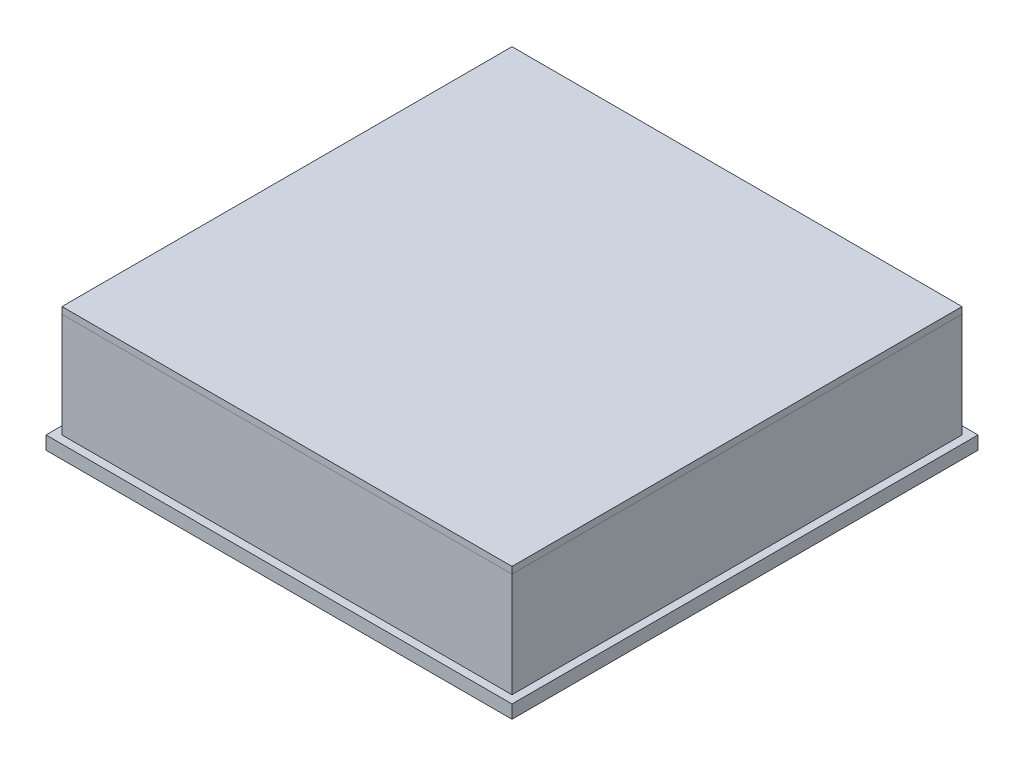
ISO-10303-21;
HEADER;
FILE_DESCRIPTION(('STEP AP214'),'2;1');
FILE_NAME('part.step','',(''),(''),'','','');
FILE_SCHEMA(('AUTOMOTIVE_DESIGN { 1 0 10303 214 1 1 1 1 }'));
ENDSEC;
DATA;
#1=APPLICATION_CONTEXT('core data for automotive mechanical design processes');
#2=APPLICATION_PROTOCOL_DEFINITION('international standard','automotive_design',2000,#1);
#3=PRODUCT_CONTEXT('',#1,'mechanical');
#4=PRODUCT('Part','Part','',(#3));
#5=PRODUCT_RELATED_PRODUCT_CATEGORY('part','',(#4));
#6=PRODUCT_DEFINITION_FORMATION('','',#4);
#7=PRODUCT_DEFINITION_CONTEXT('part definition',#1,'design');
#8=PRODUCT_DEFINITION('design','',#6,#7);
#9=PRODUCT_DEFINITION_SHAPE('','',#8);
#10=(LENGTH_UNIT() NAMED_UNIT(*) SI_UNIT(.MILLI.,.METRE.));
#11=(NAMED_UNIT(*) PLANE_ANGLE_UNIT() SI_UNIT($,.RADIAN.));
#12=(NAMED_UNIT(*) SI_UNIT($,.STERADIAN.) SOLID_ANGLE_UNIT());
#13=UNCERTAINTY_MEASURE_WITH_UNIT(LENGTH_MEASURE(1.E-05),#10,'distance_accuracy_value','');
#14=(GEOMETRIC_REPRESENTATION_CONTEXT(3) GLOBAL_UNCERTAINTY_ASSIGNED_CONTEXT((#13)) GLOBAL_UNIT_ASSIGNED_CONTEXT((#10,
#11,#12)) REPRESENTATION_CONTEXT('',''));
#15=CARTESIAN_POINT('',(0.,0.,0.));
#16=DIRECTION('',(0.,0.,1.));
#17=DIRECTION('',(1.,0.,0.));
#18=AXIS2_PLACEMENT_3D('',#15,#16,#17);
#19=CARTESIAN_POINT('',(-4304.792,2126.996,4304.792));
#20=DIRECTION('',(1.,0.,0.));
#21=DIRECTION('',(0.,0.,-1.));
#22=AXIS2_PLACEMENT_3D('',#19,#20,#21);
#23=PLANE('',#22);
#24=DIRECTION('',(0.,0.,1.));
#25=VECTOR('',#24,1.);
#26=CARTESIAN_POINT('',(-4304.792,1999.996,4304.792));
#27=LINE('',#26,#25);
#28=CARTESIAN_POINT('',(-4304.792,1999.996,-4304.792));
#29=VERTEX_POINT('',#28);
#30=CARTESIAN_POINT('',(-4304.792,1999.996,4304.792));
#31=VERTEX_POINT('',#30);
#32=EDGE_CURVE('E116',#29,#31,#27,.T.);
#33=ORIENTED_EDGE('',*,*,#32,.T.);
#34=DIRECTION('',(0.,-1.,0.));
#35=VECTOR('',#34,1.);
#36=CARTESIAN_POINT('',(-4304.792,2126.996,4304.792));
#37=LINE('',#36,#35);
#38=CARTESIAN_POINT('',(-4304.792,2126.996,4304.792));
#39=VERTEX_POINT('',#38);
#40=EDGE_CURVE('E12',#39,#31,#37,.T.);
#41=ORIENTED_EDGE('',*,*,#40,.F.);
#42=DIRECTION('',(0.,0.,1.));
#43=VECTOR('',#42,1.);
#44=CARTESIAN_POINT('',(-4304.792,2126.996,4304.792));
#45=LINE('',#44,#43);
#46=CARTESIAN_POINT('',(-4304.792,2126.996,-4304.792));
#47=VERTEX_POINT('',#46);
#48=EDGE_CURVE('E104',#47,#39,#45,.T.);
#49=ORIENTED_EDGE('',*,*,#48,.F.);
#50=DIRECTION('',(0.,-1.,0.));
#51=VECTOR('',#50,1.);
#52=CARTESIAN_POINT('',(-4304.792,2126.996,-4304.792));
#53=LINE('',#52,#51);
#54=EDGE_CURVE('E112',#47,#29,#53,.T.);
#55=ORIENTED_EDGE('',*,*,#54,.T.);
#56=EDGE_LOOP('',(#33,#41,#49,#55));
#57=FACE_BOUND('',#56,.T.);
#58=ADVANCED_FACE('F53',(#57),#23,.F.);
#59=CARTESIAN_POINT('',(4304.792,2126.996,4304.792));
#60=DIRECTION('',(0.,0.,-1.));
#61=DIRECTION('',(-1.,0.,0.));
#62=AXIS2_PLACEMENT_3D('',#59,#60,#61);
#63=PLANE('',#62);
#64=DIRECTION('',(1.,0.,0.));
#65=VECTOR('',#64,1.);
#66=CARTESIAN_POINT('',(4304.792,1999.996,4304.792));
#67=LINE('',#66,#65);
#68=CARTESIAN_POINT('',(4304.792,1999.996,4304.792));
#69=VERTEX_POINT('',#68);
#70=EDGE_CURVE('E108',#31,#69,#67,.T.);
#71=ORIENTED_EDGE('',*,*,#70,.T.);
#72=DIRECTION('',(0.,-1.,0.));
#73=VECTOR('',#72,1.);
#74=CARTESIAN_POINT('',(4304.792,2126.996,4304.792));
#75=LINE('',#74,#73);
#76=CARTESIAN_POINT('',(4304.792,2126.996,4304.792));
#77=VERTEX_POINT('',#76);
#78=EDGE_CURVE('E61',#77,#69,#75,.T.);
#79=ORIENTED_EDGE('',*,*,#78,.F.);
#80=DIRECTION('',(1.,0.,0.));
#81=VECTOR('',#80,1.);
#82=CARTESIAN_POINT('',(4304.792,2126.996,4304.792));
#83=LINE('',#82,#81);
#84=EDGE_CURVE('E99',#39,#77,#83,.T.);
#85=ORIENTED_EDGE('',*,*,#84,.F.);
#86=ORIENTED_EDGE('',*,*,#40,.T.);
#87=EDGE_LOOP('',(#71,#79,#85,#86));
#88=FACE_BOUND('',#87,.T.);
#89=ADVANCED_FACE('F107',(#88),#63,.F.);
#90=CARTESIAN_POINT('',(4304.792,2126.996,4304.792));
#91=DIRECTION('',(-1.,0.,0.));
#92=DIRECTION('',(0.,0.,1.));
#93=AXIS2_PLACEMENT_3D('',#90,#91,#92);
#94=PLANE('',#93);
#95=DIRECTION('',(0.,0.,-1.));
#96=VECTOR('',#95,1.);
#97=CARTESIAN_POINT('',(4304.792,1999.996,4304.792));
#98=LINE('',#97,#96);
#99=CARTESIAN_POINT('',(4304.792,1999.996,-4304.792));
#100=VERTEX_POINT('',#99);
#101=EDGE_CURVE('E86',#69,#100,#98,.T.);
#102=ORIENTED_EDGE('',*,*,#101,.T.);
#103=DIRECTION('',(0.,-1.,0.));
#104=VECTOR('',#103,1.);
#105=CARTESIAN_POINT('',(4304.792,2126.996,-4304.792));
#106=LINE('',#105,#104);
#107=CARTESIAN_POINT('',(4304.792,2126.996,-4304.792));
#108=VERTEX_POINT('',#107);
#109=EDGE_CURVE('E109',#108,#100,#106,.T.);
#110=ORIENTED_EDGE('',*,*,#109,.F.);
#111=DIRECTION('',(0.,0.,-1.));
#112=VECTOR('',#111,1.);
#113=CARTESIAN_POINT('',(4304.792,2126.996,4304.792));
#114=LINE('',#113,#112);
#115=EDGE_CURVE('E102',#77,#108,#114,.T.);
#116=ORIENTED_EDGE('',*,*,#115,.F.);
#117=ORIENTED_EDGE('',*,*,#78,.T.);
#118=EDGE_LOOP('',(#102,#110,#116,#117));
#119=FACE_BOUND('',#118,.T.);
#120=ADVANCED_FACE('F110',(#119),#94,.F.);
#121=CARTESIAN_POINT('',(4304.792,2126.996,-4304.792));
#122=DIRECTION('',(0.,0.,1.));
#123=DIRECTION('',(1.,0.,0.));
#124=AXIS2_PLACEMENT_3D('',#121,#122,#123);
#125=PLANE('',#124);
#126=DIRECTION('',(-1.,0.,0.));
#127=VECTOR('',#126,1.);
#128=CARTESIAN_POINT('',(4304.792,1999.996,-4304.792));
#129=LINE('',#128,#127);
#130=EDGE_CURVE('E92',#100,#29,#129,.T.);
#131=ORIENTED_EDGE('',*,*,#130,.T.);
#132=ORIENTED_EDGE('',*,*,#54,.F.);
#133=DIRECTION('',(-1.,0.,0.));
#134=VECTOR('',#133,1.);
#135=CARTESIAN_POINT('',(4304.792,2126.996,-4304.792));
#136=LINE('',#135,#134);
#137=EDGE_CURVE('E69',#108,#47,#136,.T.);
#138=ORIENTED_EDGE('',*,*,#137,.F.);
#139=ORIENTED_EDGE('',*,*,#109,.T.);
#140=EDGE_LOOP('',(#131,#132,#138,#139));
#141=FACE_BOUND('',#140,.T.);
#142=ADVANCED_FACE('F123',(#141),#125,.F.);
#143=CARTESIAN_POINT('',(0.,2126.996,0.));
#144=DIRECTION('',(0.,1.,0.));
#145=DIRECTION('',(0.,0.,1.));
#146=AXIS2_PLACEMENT_3D('',#143,#144,#145);
#147=PLANE('',#146);
#148=ORIENTED_EDGE('',*,*,#48,.T.);
#149=ORIENTED_EDGE('',*,*,#84,.T.);
#150=ORIENTED_EDGE('',*,*,#115,.T.);
#151=ORIENTED_EDGE('',*,*,#137,.T.);
#152=EDGE_LOOP('',(#148,#149,#150,#151));
#153=FACE_BOUND('',#152,.T.);
#154=ADVANCED_FACE('F100',(#153),#147,.T.);
#155=CARTESIAN_POINT('',(0.,1999.996,0.));
#156=DIRECTION('',(0.,1.,0.));
#157=DIRECTION('',(0.,0.,1.));
#158=AXIS2_PLACEMENT_3D('',#155,#156,#157);
#159=PLANE('',#158);
#160=ORIENTED_EDGE('',*,*,#32,.F.);
#161=ORIENTED_EDGE('',*,*,#130,.F.);
#162=ORIENTED_EDGE('',*,*,#101,.F.);
#163=ORIENTED_EDGE('',*,*,#70,.F.);
#164=EDGE_LOOP('',(#160,#161,#162,#163));
#165=FACE_BOUND('',#164,.T.);
#166=ADVANCED_FACE('F126',(#165),#159,.F.);
#167=CLOSED_SHELL('',(#58,#89,#120,#142,#154,#166));
#168=MANIFOLD_SOLID_BREP('B2',#167);
#169=CARTESIAN_POINT('',(0.,0.,0.));
#170=DIRECTION('',(0.,1.,0.));
#171=DIRECTION('',(0.,0.,1.));
#172=AXIS2_PLACEMENT_3D('',#169,#170,#171);
#173=PLANE('',#172);
#174=DIRECTION('',(1.,0.,0.));
#175=VECTOR('',#174,1.);
#176=CARTESIAN_POINT('',(0.,0.,1504.4509357839));
#177=LINE('',#176,#175);
#178=CARTESIAN_POINT('',(-1809.25093578353,0.,1504.4509357839));
#179=VERTEX_POINT('',#178);
#180=CARTESIAN_POINT('',(-1504.45093578353,0.,1504.4509357839));
#181=VERTEX_POINT('',#180);
#182=EDGE_CURVE('E422',#179,#181,#177,.T.);
#183=ORIENTED_EDGE('',*,*,#182,.T.);
#184=DIRECTION('',(0.,0.,1.));
#185=VECTOR('',#184,1.);
#186=CARTESIAN_POINT('',(-1504.45093578353,0.,0.));
#187=LINE('',#186,#185);
#188=CARTESIAN_POINT('',(-1504.45093578353,0.,1809.2509357839));
#189=VERTEX_POINT('',#188);
#190=EDGE_CURVE('E438',#181,#189,#187,.T.);
#191=ORIENTED_EDGE('',*,*,#190,.T.);
#192=DIRECTION('',(1.,0.,0.));
#193=VECTOR('',#192,1.);
#194=CARTESIAN_POINT('',(0.,0.,1809.2509357839));
#195=LINE('',#194,#193);
#196=CARTESIAN_POINT('',(-1809.25093578353,0.,1809.2509357839));
#197=VERTEX_POINT('',#196);
#198=EDGE_CURVE('E435',#197,#189,#195,.T.);
#199=ORIENTED_EDGE('',*,*,#198,.F.);
#200=DIRECTION('',(0.,0.,1.));
#201=VECTOR('',#200,1.);
#202=CARTESIAN_POINT('',(-1809.25093578353,0.,0.));
#203=LINE('',#202,#201);
#204=EDGE_CURVE('E211',#179,#197,#203,.T.);
#205=ORIENTED_EDGE('',*,*,#204,.F.);
#206=EDGE_LOOP('',(#183,#191,#199,#205));
#207=FACE_BOUND('',#206,.T.);
#208=DIRECTION('',(0.,0.,-1.));
#209=VECTOR('',#208,1.);
#210=CARTESIAN_POINT('',(1504.45093578425,0.,0.));
#211=LINE('',#210,#209);
#212=CARTESIAN_POINT('',(1504.45093578425,0.,1809.25093578354));
#213=VERTEX_POINT('',#212);
#214=CARTESIAN_POINT('',(1504.45093578425,0.,1504.45093578354));
#215=VERTEX_POINT('',#214);
#216=EDGE_CURVE('E451',#213,#215,#211,.T.);
#217=ORIENTED_EDGE('',*,*,#216,.T.);
#218=DIRECTION('',(1.,0.,0.));
#219=VECTOR('',#218,1.);
#220=CARTESIAN_POINT('',(0.,0.,1504.45093578354));
#221=LINE('',#220,#219);
#222=CARTESIAN_POINT('',(1809.25093578425,0.,1504.45093578354));
#223=VERTEX_POINT('',#222);
#224=EDGE_CURVE('E469',#215,#223,#221,.T.);
#225=ORIENTED_EDGE('',*,*,#224,.T.);
#226=DIRECTION('',(0.,0.,-1.));
#227=VECTOR('',#226,1.);
#228=CARTESIAN_POINT('',(1809.25093578425,0.,0.));
#229=LINE('',#228,#227);
#230=CARTESIAN_POINT('',(1809.25093578425,0.,1809.25093578354));
#231=VERTEX_POINT('',#230);
#232=EDGE_CURVE('E466',#231,#223,#229,.T.);
#233=ORIENTED_EDGE('',*,*,#232,.F.);
#234=DIRECTION('',(1.,0.,0.));
#235=VECTOR('',#234,1.);
#236=CARTESIAN_POINT('',(0.,0.,1809.25093578354));
#237=LINE('',#236,#235);
#238=EDGE_CURVE('E463',#213,#231,#237,.T.);
#239=ORIENTED_EDGE('',*,*,#238,.F.);
#240=EDGE_LOOP('',(#217,#225,#233,#239));
#241=FACE_BOUND('',#240,.T.);
#242=DIRECTION('',(-1.,0.,0.));
#243=VECTOR('',#242,1.);
#244=CARTESIAN_POINT('',(0.,0.,-1504.45093578424));
#245=LINE('',#244,#243);
#246=CARTESIAN_POINT('',(1809.2509357839,0.,-1504.45093578424));
#247=VERTEX_POINT('',#246);
#248=CARTESIAN_POINT('',(1504.4509357839,0.,-1504.45093578424));
#249=VERTEX_POINT('',#248);
#250=EDGE_CURVE('E483',#247,#249,#245,.T.);
#251=ORIENTED_EDGE('',*,*,#250,.T.);
#252=DIRECTION('',(0.,0.,-1.));
#253=VECTOR('',#252,1.);
#254=CARTESIAN_POINT('',(1504.4509357839,0.,0.));
#255=LINE('',#254,#253);
#256=CARTESIAN_POINT('',(1504.4509357839,0.,-1809.25093578424));
#257=VERTEX_POINT('',#256);
#258=EDGE_CURVE('E501',#249,#257,#255,.T.);
#259=ORIENTED_EDGE('',*,*,#258,.T.);
#260=DIRECTION('',(-1.,0.,0.));
#261=VECTOR('',#260,1.);
#262=CARTESIAN_POINT('',(0.,0.,-1809.25093578424));
#263=LINE('',#262,#261);
#264=CARTESIAN_POINT('',(1809.2509357839,0.,-1809.25093578424));
#265=VERTEX_POINT('',#264);
#266=EDGE_CURVE('E498',#265,#257,#263,.T.);
#267=ORIENTED_EDGE('',*,*,#266,.F.);
#268=DIRECTION('',(0.,0.,-1.));
#269=VECTOR('',#268,1.);
#270=CARTESIAN_POINT('',(1809.2509357839,0.,0.));
#271=LINE('',#270,#269);
#272=EDGE_CURVE('E495',#247,#265,#271,.T.);
#273=ORIENTED_EDGE('',*,*,#272,.F.);
#274=EDGE_LOOP('',(#251,#259,#267,#273));
#275=FACE_BOUND('',#274,.T.);
#276=DIRECTION('',(0.,0.,-1.));
#277=VECTOR('',#276,1.);
#278=CARTESIAN_POINT('',(3999.992,0.,3999.992));
#279=LINE('',#278,#277);
#280=CARTESIAN_POINT('',(3999.992,0.,3999.992));
#281=VERTEX_POINT('',#280);
#282=CARTESIAN_POINT('',(3999.992,0.,-3999.992));
#283=VERTEX_POINT('',#282);
#284=EDGE_CURVE('E564',#281,#283,#279,.T.);
#285=ORIENTED_EDGE('',*,*,#284,.T.);
#286=DIRECTION('',(-1.,0.,0.));
#287=VECTOR('',#286,1.);
#288=CARTESIAN_POINT('',(3999.992,0.,-3999.992));
#289=LINE('',#288,#287);
#290=CARTESIAN_POINT('',(-3999.992,0.,-3999.992));
#291=VERTEX_POINT('',#290);
#292=EDGE_CURVE('E551',#283,#291,#289,.T.);
#293=ORIENTED_EDGE('',*,*,#292,.T.);
#294=DIRECTION('',(0.,0.,1.));
#295=VECTOR('',#294,1.);
#296=CARTESIAN_POINT('',(-3999.992,0.,3999.992));
#297=LINE('',#296,#295);
#298=CARTESIAN_POINT('',(-3999.992,0.,3999.992));
#299=VERTEX_POINT('',#298);
#300=EDGE_CURVE('E547',#291,#299,#297,.T.);
#301=ORIENTED_EDGE('',*,*,#300,.T.);
#302=DIRECTION('',(1.,0.,0.));
#303=VECTOR('',#302,1.);
#304=CARTESIAN_POINT('',(3999.992,0.,3999.992));
#305=LINE('',#304,#303);
#306=EDGE_CURVE('E561',#299,#281,#305,.T.);
#307=ORIENTED_EDGE('',*,*,#306,.T.);
#308=EDGE_LOOP('',(#285,#293,#301,#307));
#309=FACE_BOUND('',#308,.T.);
#310=DIRECTION('',(0.,0.,1.));
#311=VECTOR('',#310,1.);
#312=CARTESIAN_POINT('',(-1809.25093578388,0.,0.));
#313=LINE('',#312,#311);
#314=CARTESIAN_POINT('',(-1809.25093578388,0.,-1809.25093578388));
#315=VERTEX_POINT('',#314);
#316=CARTESIAN_POINT('',(-1809.25093578388,0.,-1504.45093578388));
#317=VERTEX_POINT('',#316);
#318=EDGE_CURVE('E528',#315,#317,#313,.T.);
#319=ORIENTED_EDGE('',*,*,#318,.F.);
#320=DIRECTION('',(-1.,0.,0.));
#321=VECTOR('',#320,1.);
#322=CARTESIAN_POINT('',(0.,0.,-1809.25093578388));
#323=LINE('',#322,#321);
#324=CARTESIAN_POINT('',(-1504.45093578388,0.,-1809.25093578388));
#325=VERTEX_POINT('',#324);
#326=EDGE_CURVE('E515',#325,#315,#323,.T.);
#327=ORIENTED_EDGE('',*,*,#326,.F.);
#328=DIRECTION('',(0.,0.,1.));
#329=VECTOR('',#328,1.);
#330=CARTESIAN_POINT('',(-1504.45093578388,0.,0.));
#331=LINE('',#330,#329);
#332=CARTESIAN_POINT('',(-1504.45093578388,0.,-1504.45093578388));
#333=VERTEX_POINT('',#332);
#334=EDGE_CURVE('E533',#325,#333,#331,.T.);
#335=ORIENTED_EDGE('',*,*,#334,.T.);
#336=DIRECTION('',(-1.,0.,0.));
#337=VECTOR('',#336,1.);
#338=CARTESIAN_POINT('',(0.,0.,-1504.45093578388));
#339=LINE('',#338,#337);
#340=EDGE_CURVE('E531',#333,#317,#339,.T.);
#341=ORIENTED_EDGE('',*,*,#340,.T.);
#342=EDGE_LOOP('',(#319,#327,#335,#341));
#343=FACE_BOUND('',#342,.T.);
#344=ADVANCED_FACE('F189',(#207,#241,#275,#309,#343),#173,.T.);
#345=CARTESIAN_POINT('',(0.,1999.996,0.));
#346=DIRECTION('',(0.,-1.,0.));
#347=DIRECTION('',(0.,0.,-1.));
#348=AXIS2_PLACEMENT_3D('',#345,#346,#347);
#349=PLANE('',#348);
#350=DIRECTION('',(1.,0.,0.));
#351=VECTOR('',#350,1.);
#352=CARTESIAN_POINT('',(4304.792,1999.996,4304.792));
#353=LINE('',#352,#351);
#354=CARTESIAN_POINT('',(-4304.792,1999.996,4304.792));
#355=VERTEX_POINT('',#354);
#356=CARTESIAN_POINT('',(4304.792,1999.996,4304.792));
#357=VERTEX_POINT('',#356);
#358=EDGE_CURVE('E579',#355,#357,#353,.T.);
#359=ORIENTED_EDGE('',*,*,#358,.T.);
#360=DIRECTION('',(0.,0.,-1.));
#361=VECTOR('',#360,1.);
#362=CARTESIAN_POINT('',(4304.792,1999.996,4304.792));
#363=LINE('',#362,#361);
#364=CARTESIAN_POINT('',(4304.792,1999.996,-4304.792));
#365=VERTEX_POINT('',#364);
#366=EDGE_CURVE('E582',#357,#365,#363,.T.);
#367=ORIENTED_EDGE('',*,*,#366,.T.);
#368=DIRECTION('',(-1.,0.,0.));
#369=VECTOR('',#368,1.);
#370=CARTESIAN_POINT('',(4304.792,1999.996,-4304.792));
#371=LINE('',#370,#369);
#372=CARTESIAN_POINT('',(-4304.792,1999.996,-4304.792));
#373=VERTEX_POINT('',#372);
#374=EDGE_CURVE('E584',#365,#373,#371,.T.);
#375=ORIENTED_EDGE('',*,*,#374,.T.);
#376=DIRECTION('',(0.,0.,1.));
#377=VECTOR('',#376,1.);
#378=CARTESIAN_POINT('',(-4304.792,1999.996,4304.792));
#379=LINE('',#378,#377);
#380=EDGE_CURVE('E586',#373,#355,#379,.T.);
#381=ORIENTED_EDGE('',*,*,#380,.T.);
#382=EDGE_LOOP('',(#359,#367,#375,#381));
#383=FACE_BOUND('',#382,.T.);
#384=DIRECTION('',(0.,0.,1.));
#385=VECTOR('',#384,1.);
#386=CARTESIAN_POINT('',(-3999.992,1999.996,3999.992));
#387=LINE('',#386,#385);
#388=CARTESIAN_POINT('',(-3999.992,1999.996,-3999.992));
#389=VERTEX_POINT('',#388);
#390=CARTESIAN_POINT('',(-3999.992,1999.996,3999.992));
#391=VERTEX_POINT('',#390);
#392=EDGE_CURVE('E548',#389,#391,#387,.T.);
#393=ORIENTED_EDGE('',*,*,#392,.F.);
#394=DIRECTION('',(-1.,0.,0.));
#395=VECTOR('',#394,1.);
#396=CARTESIAN_POINT('',(3999.992,1999.996,-3999.992));
#397=LINE('',#396,#395);
#398=CARTESIAN_POINT('',(3999.992,1999.996,-3999.992));
#399=VERTEX_POINT('',#398);
#400=EDGE_CURVE('E556',#399,#389,#397,.T.);
#401=ORIENTED_EDGE('',*,*,#400,.F.);
#402=DIRECTION('',(0.,0.,-1.));
#403=VECTOR('',#402,1.);
#404=CARTESIAN_POINT('',(3999.992,1999.996,3999.992));
#405=LINE('',#404,#403);
#406=CARTESIAN_POINT('',(3999.992,1999.996,3999.992));
#407=VERTEX_POINT('',#406);
#408=EDGE_CURVE('E553',#407,#399,#405,.T.);
#409=ORIENTED_EDGE('',*,*,#408,.F.);
#410=DIRECTION('',(1.,0.,0.));
#411=VECTOR('',#410,1.);
#412=CARTESIAN_POINT('',(3999.992,1999.996,3999.992));
#413=LINE('',#412,#411);
#414=EDGE_CURVE('E550',#391,#407,#413,.T.);
#415=ORIENTED_EDGE('',*,*,#414,.F.);
#416=EDGE_LOOP('',(#393,#401,#409,#415));
#417=FACE_BOUND('',#416,.T.);
#418=ADVANCED_FACE('F613',(#383,#417),#349,.F.);
#419=CARTESIAN_POINT('',(4304.792,1999.996,4304.792));
#420=DIRECTION('',(0.,0.,-1.));
#421=DIRECTION('',(-1.,0.,0.));
#422=AXIS2_PLACEMENT_3D('',#419,#420,#421);
#423=PLANE('',#422);
#424=DIRECTION('',(0.,-1.,0.));
#425=VECTOR('',#424,1.);
#426=CARTESIAN_POINT('',(-4304.792,1999.996,4304.792));
#427=LINE('',#426,#425);
#428=CARTESIAN_POINT('',(-4304.792,4.44089209850063E-13,4304.792));
#429=VERTEX_POINT('',#428);
#430=EDGE_CURVE('E588',#355,#429,#427,.T.);
#431=ORIENTED_EDGE('',*,*,#430,.T.);
#432=DIRECTION('',(1.,0.,0.));
#433=VECTOR('',#432,1.);
#434=CARTESIAN_POINT('',(4304.792,0.,4304.792));
#435=LINE('',#434,#433);
#436=CARTESIAN_POINT('',(4304.792,0.,4304.792));
#437=VERTEX_POINT('',#436);
#438=EDGE_CURVE('E204',#429,#437,#435,.T.);
#439=ORIENTED_EDGE('',*,*,#438,.T.);
#440=DIRECTION('',(0.,-1.,0.));
#441=VECTOR('',#440,1.);
#442=CARTESIAN_POINT('',(4304.792,1999.996,4304.792));
#443=LINE('',#442,#441);
#444=EDGE_CURVE('E197',#357,#437,#443,.T.);
#445=ORIENTED_EDGE('',*,*,#444,.F.);
#446=ORIENTED_EDGE('',*,*,#358,.F.);
#447=EDGE_LOOP('',(#431,#439,#445,#446));
#448=FACE_BOUND('',#447,.T.);
#449=ADVANCED_FACE('F191',(#448),#423,.F.);
#450=CARTESIAN_POINT('',(4304.792,1999.996,4304.792));
#451=DIRECTION('',(-1.,0.,0.));
#452=DIRECTION('',(0.,0.,1.));
#453=AXIS2_PLACEMENT_3D('',#450,#451,#452);
#454=PLANE('',#453);
#455=ORIENTED_EDGE('',*,*,#444,.T.);
#456=DIRECTION('',(0.,0.,-1.));
#457=VECTOR('',#456,1.);
#458=CARTESIAN_POINT('',(4304.792,0.,4304.792));
#459=LINE('',#458,#457);
#460=CARTESIAN_POINT('',(4304.792,0.,-4304.792));
#461=VERTEX_POINT('',#460);
#462=EDGE_CURVE('E418',#437,#461,#459,.T.);
#463=ORIENTED_EDGE('',*,*,#462,.T.);
#464=DIRECTION('',(0.,-1.,0.));
#465=VECTOR('',#464,1.);
#466=CARTESIAN_POINT('',(4304.792,1999.996,-4304.792));
#467=LINE('',#466,#465);
#468=EDGE_CURVE('E594',#365,#461,#467,.T.);
#469=ORIENTED_EDGE('',*,*,#468,.F.);
#470=ORIENTED_EDGE('',*,*,#366,.F.);
#471=EDGE_LOOP('',(#455,#463,#469,#470));
#472=FACE_BOUND('',#471,.T.);
#473=ADVANCED_FACE('F599',(#472),#454,.F.);
#474=CARTESIAN_POINT('',(4304.792,1999.996,-4304.792));
#475=DIRECTION('',(0.,0.,1.));
#476=DIRECTION('',(1.,0.,0.));
#477=AXIS2_PLACEMENT_3D('',#474,#475,#476);
#478=PLANE('',#477);
#479=ORIENTED_EDGE('',*,*,#468,.T.);
#480=DIRECTION('',(-1.,0.,0.));
#481=VECTOR('',#480,1.);
#482=CARTESIAN_POINT('',(4304.792,0.,-4304.792));
#483=LINE('',#482,#481);
#484=CARTESIAN_POINT('',(-4304.792,0.,-4304.792));
#485=VERTEX_POINT('',#484);
#486=EDGE_CURVE('E412',#461,#485,#483,.T.);
#487=ORIENTED_EDGE('',*,*,#486,.T.);
#488=DIRECTION('',(0.,-1.,0.));
#489=VECTOR('',#488,1.);
#490=CARTESIAN_POINT('',(-4304.792,1999.996,-4304.792));
#491=LINE('',#490,#489);
#492=EDGE_CURVE('E591',#373,#485,#491,.T.);
#493=ORIENTED_EDGE('',*,*,#492,.F.);
#494=ORIENTED_EDGE('',*,*,#374,.F.);
#495=EDGE_LOOP('',(#479,#487,#493,#494));
#496=FACE_BOUND('',#495,.T.);
#497=ADVANCED_FACE('F610',(#496),#478,.F.);
#498=CARTESIAN_POINT('',(-4304.792,1999.996,4304.792));
#499=DIRECTION('',(1.,0.,0.));
#500=DIRECTION('',(0.,0.,-1.));
#501=AXIS2_PLACEMENT_3D('',#498,#499,#500);
#502=PLANE('',#501);
#503=ORIENTED_EDGE('',*,*,#492,.T.);
#504=DIRECTION('',(0.,0.,1.));
#505=VECTOR('',#504,1.);
#506=CARTESIAN_POINT('',(-4304.792,0.,4304.792));
#507=LINE('',#506,#505);
#508=EDGE_CURVE('E51',#485,#429,#507,.T.);
#509=ORIENTED_EDGE('',*,*,#508,.T.);
#510=ORIENTED_EDGE('',*,*,#430,.F.);
#511=ORIENTED_EDGE('',*,*,#380,.F.);
#512=EDGE_LOOP('',(#503,#509,#510,#511));
#513=FACE_BOUND('',#512,.T.);
#514=ADVANCED_FACE('F606',(#513),#502,.F.);
#515=CARTESIAN_POINT('',(-3999.992,1999.996,3999.992));
#516=DIRECTION('',(1.,0.,0.));
#517=DIRECTION('',(0.,0.,-1.));
#518=AXIS2_PLACEMENT_3D('',#515,#516,#517);
#519=PLANE('',#518);
#520=ORIENTED_EDGE('',*,*,#300,.F.);
#521=DIRECTION('',(0.,-1.,0.));
#522=VECTOR('',#521,1.);
#523=CARTESIAN_POINT('',(-3999.992,1999.996,-3999.992));
#524=LINE('',#523,#522);
#525=EDGE_CURVE('E558',#389,#291,#524,.T.);
#526=ORIENTED_EDGE('',*,*,#525,.F.);
#527=ORIENTED_EDGE('',*,*,#392,.T.);
#528=DIRECTION('',(0.,-1.,0.));
#529=VECTOR('',#528,1.);
#530=CARTESIAN_POINT('',(-3999.992,1999.996,3999.992));
#531=LINE('',#530,#529);
#532=EDGE_CURVE('E576',#391,#299,#531,.T.);
#533=ORIENTED_EDGE('',*,*,#532,.T.);
#534=EDGE_LOOP('',(#520,#526,#527,#533));
#535=FACE_BOUND('',#534,.T.);
#536=ADVANCED_FACE('F624',(#535),#519,.T.);
#537=CARTESIAN_POINT('',(3999.992,1999.996,3999.992));
#538=DIRECTION('',(0.,0.,-1.));
#539=DIRECTION('',(-1.,0.,0.));
#540=AXIS2_PLACEMENT_3D('',#537,#538,#539);
#541=PLANE('',#540);
#542=ORIENTED_EDGE('',*,*,#306,.F.);
#543=ORIENTED_EDGE('',*,*,#532,.F.);
#544=ORIENTED_EDGE('',*,*,#414,.T.);
#545=DIRECTION('',(0.,-1.,0.));
#546=VECTOR('',#545,1.);
#547=CARTESIAN_POINT('',(3999.992,1999.996,3999.992));
#548=LINE('',#547,#546);
#549=EDGE_CURVE('E574',#407,#281,#548,.T.);
#550=ORIENTED_EDGE('',*,*,#549,.T.);
#551=EDGE_LOOP('',(#542,#543,#544,#550));
#552=FACE_BOUND('',#551,.T.);
#553=ADVANCED_FACE('F626',(#552),#541,.T.);
#554=CARTESIAN_POINT('',(3999.992,1999.996,3999.992));
#555=DIRECTION('',(-1.,0.,0.));
#556=DIRECTION('',(0.,0.,1.));
#557=AXIS2_PLACEMENT_3D('',#554,#555,#556);
#558=PLANE('',#557);
#559=ORIENTED_EDGE('',*,*,#284,.F.);
#560=ORIENTED_EDGE('',*,*,#549,.F.);
#561=ORIENTED_EDGE('',*,*,#408,.T.);
#562=DIRECTION('',(0.,-1.,0.));
#563=VECTOR('',#562,1.);
#564=CARTESIAN_POINT('',(3999.992,1999.996,-3999.992));
#565=LINE('',#564,#563);
#566=EDGE_CURVE('E571',#399,#283,#565,.T.);
#567=ORIENTED_EDGE('',*,*,#566,.T.);
#568=EDGE_LOOP('',(#559,#560,#561,#567));
#569=FACE_BOUND('',#568,.T.);
#570=ADVANCED_FACE('F634',(#569),#558,.T.);
#571=CARTESIAN_POINT('',(3999.992,1999.996,-3999.992));
#572=DIRECTION('',(0.,0.,1.));
#573=DIRECTION('',(1.,0.,0.));
#574=AXIS2_PLACEMENT_3D('',#571,#572,#573);
#575=PLANE('',#574);
#576=ORIENTED_EDGE('',*,*,#292,.F.);
#577=ORIENTED_EDGE('',*,*,#566,.F.);
#578=ORIENTED_EDGE('',*,*,#400,.T.);
#579=ORIENTED_EDGE('',*,*,#525,.T.);
#580=EDGE_LOOP('',(#576,#577,#578,#579));
#581=FACE_BOUND('',#580,.T.);
#582=ADVANCED_FACE('F632',(#581),#575,.T.);
#583=CARTESIAN_POINT('',(0.,2431.04829381132,-1809.25093578388));
#584=DIRECTION('',(0.,0.,1.));
#585=DIRECTION('',(1.,0.,0.));
#586=AXIS2_PLACEMENT_3D('',#583,#584,#585);
#587=PLANE('',#586);
#588=DIRECTION('',(0.,-1.,0.));
#589=VECTOR('',#588,1.);
#590=CARTESIAN_POINT('',(-1809.25093578388,2431.04829381132,-1809.25093578388));
#591=LINE('',#590,#589);
#592=CARTESIAN_POINT('',(-1809.25093578388,1999.996,-1809.25093578388));
#593=VERTEX_POINT('',#592);
#594=EDGE_CURVE('E519',#593,#315,#591,.T.);
#595=ORIENTED_EDGE('',*,*,#594,.F.);
#596=DIRECTION('',(1.,0.,0.));
#597=VECTOR('',#596,1.);
#598=CARTESIAN_POINT('',(0.,1999.996,-1809.25093578388));
#599=LINE('',#598,#597);
#600=CARTESIAN_POINT('',(-1504.45093578388,1999.996,-1809.25093578388));
#601=VERTEX_POINT('',#600);
#602=EDGE_CURVE('E522',#593,#601,#599,.T.);
#603=ORIENTED_EDGE('',*,*,#602,.T.);
#604=DIRECTION('',(0.,-1.,0.));
#605=VECTOR('',#604,1.);
#606=CARTESIAN_POINT('',(-1504.45093578388,2431.04829381132,-1809.25093578388));
#607=LINE('',#606,#605);
#608=EDGE_CURVE('E535',#601,#325,#607,.T.);
#609=ORIENTED_EDGE('',*,*,#608,.T.);
#610=ORIENTED_EDGE('',*,*,#326,.T.);
#611=EDGE_LOOP('',(#595,#603,#609,#610));
#612=FACE_BOUND('',#611,.T.);
#613=ADVANCED_FACE('F641',(#612),#587,.F.);
#614=CARTESIAN_POINT('',(-1809.25093578388,2431.04829381132,0.));
#615=DIRECTION('',(1.,0.,0.));
#616=DIRECTION('',(0.,0.,-1.));
#617=AXIS2_PLACEMENT_3D('',#614,#615,#616);
#618=PLANE('',#617);
#619=DIRECTION('',(0.,-1.,0.));
#620=VECTOR('',#619,1.);
#621=CARTESIAN_POINT('',(-1809.25093578388,2431.04829381132,-1504.45093578388));
#622=LINE('',#621,#620);
#623=CARTESIAN_POINT('',(-1809.25093578388,1999.996,-1504.45093578388));
#624=VERTEX_POINT('',#623);
#625=EDGE_CURVE('E541',#624,#317,#622,.T.);
#626=ORIENTED_EDGE('',*,*,#625,.F.);
#627=DIRECTION('',(0.,0.,-1.));
#628=VECTOR('',#627,1.);
#629=CARTESIAN_POINT('',(-1809.25093578388,1999.996,0.));
#630=LINE('',#629,#628);
#631=EDGE_CURVE('E518',#624,#593,#630,.T.);
#632=ORIENTED_EDGE('',*,*,#631,.T.);
#633=ORIENTED_EDGE('',*,*,#594,.T.);
#634=ORIENTED_EDGE('',*,*,#318,.T.);
#635=EDGE_LOOP('',(#626,#632,#633,#634));
#636=FACE_BOUND('',#635,.T.);
#637=ADVANCED_FACE('F652',(#636),#618,.F.);
#638=CARTESIAN_POINT('',(0.,2431.04829381132,-1504.45093578388));
#639=DIRECTION('',(0.,0.,1.));
#640=DIRECTION('',(1.,0.,0.));
#641=AXIS2_PLACEMENT_3D('',#638,#639,#640);
#642=PLANE('',#641);
#643=DIRECTION('',(1.,0.,0.));
#644=VECTOR('',#643,1.);
#645=CARTESIAN_POINT('',(0.,1999.996,-1504.45093578388));
#646=LINE('',#645,#644);
#647=CARTESIAN_POINT('',(-1504.45093578388,1999.996,-1504.45093578388));
#648=VERTEX_POINT('',#647);
#649=EDGE_CURVE('E516',#624,#648,#646,.T.);
#650=ORIENTED_EDGE('',*,*,#649,.F.);
#651=ORIENTED_EDGE('',*,*,#625,.T.);
#652=ORIENTED_EDGE('',*,*,#340,.F.);
#653=DIRECTION('',(0.,-1.,0.));
#654=VECTOR('',#653,1.);
#655=CARTESIAN_POINT('',(-1504.45093578388,2431.04829381132,-1504.45093578388));
#656=LINE('',#655,#654);
#657=EDGE_CURVE('E538',#648,#333,#656,.T.);
#658=ORIENTED_EDGE('',*,*,#657,.F.);
#659=EDGE_LOOP('',(#650,#651,#652,#658));
#660=FACE_BOUND('',#659,.T.);
#661=ADVANCED_FACE('F656',(#660),#642,.T.);
#662=CARTESIAN_POINT('',(-1504.45093578388,2431.04829381132,0.));
#663=DIRECTION('',(1.,0.,0.));
#664=DIRECTION('',(0.,0.,-1.));
#665=AXIS2_PLACEMENT_3D('',#662,#663,#664);
#666=PLANE('',#665);
#667=DIRECTION('',(0.,0.,-1.));
#668=VECTOR('',#667,1.);
#669=CARTESIAN_POINT('',(-1504.45093578388,1999.996,0.));
#670=LINE('',#669,#668);
#671=EDGE_CURVE('E525',#648,#601,#670,.T.);
#672=ORIENTED_EDGE('',*,*,#671,.F.);
#673=ORIENTED_EDGE('',*,*,#657,.T.);
#674=ORIENTED_EDGE('',*,*,#334,.F.);
#675=ORIENTED_EDGE('',*,*,#608,.F.);
#676=EDGE_LOOP('',(#672,#673,#674,#675));
#677=FACE_BOUND('',#676,.T.);
#678=ADVANCED_FACE('F660',(#677),#666,.T.);
#679=CARTESIAN_POINT('',(0.,1999.996,0.));
#680=DIRECTION('',(0.,-1.,0.));
#681=DIRECTION('',(0.,0.,-1.));
#682=AXIS2_PLACEMENT_3D('',#679,#680,#681);
#683=PLANE('',#682);
#684=ORIENTED_EDGE('',*,*,#631,.F.);
#685=ORIENTED_EDGE('',*,*,#649,.T.);
#686=ORIENTED_EDGE('',*,*,#671,.T.);
#687=ORIENTED_EDGE('',*,*,#602,.F.);
#688=EDGE_LOOP('',(#684,#685,#686,#687));
#689=FACE_BOUND('',#688,.T.);
#690=ADVANCED_FACE('F664',(#689),#683,.F.);
#691=CARTESIAN_POINT('',(0.,2431.04829381132,-1504.45093578424));
#692=DIRECTION('',(0.,0.,1.));
#693=DIRECTION('',(1.,0.,0.));
#694=AXIS2_PLACEMENT_3D('',#691,#692,#693);
#695=PLANE('',#694);
#696=DIRECTION('',(1.,0.,0.));
#697=VECTOR('',#696,1.);
#698=CARTESIAN_POINT('',(0.,1999.996,-1504.45093578424));
#699=LINE('',#698,#697);
#700=CARTESIAN_POINT('',(1504.4509357839,1999.996,-1504.45093578424));
#701=VERTEX_POINT('',#700);
#702=CARTESIAN_POINT('',(1809.2509357839,1999.996,-1504.45093578424));
#703=VERTEX_POINT('',#702);
#704=EDGE_CURVE('E491',#701,#703,#699,.T.);
#705=ORIENTED_EDGE('',*,*,#704,.F.);
#706=DIRECTION('',(0.,-1.,0.));
#707=VECTOR('',#706,1.);
#708=CARTESIAN_POINT('',(1504.4509357839,2431.04829381132,-1504.45093578424));
#709=LINE('',#708,#707);
#710=EDGE_CURVE('E503',#701,#249,#709,.T.);
#711=ORIENTED_EDGE('',*,*,#710,.T.);
#712=ORIENTED_EDGE('',*,*,#250,.F.);
#713=DIRECTION('',(0.,-1.,0.));
#714=VECTOR('',#713,1.);
#715=CARTESIAN_POINT('',(1809.2509357839,2431.04829381132,-1504.45093578424));
#716=LINE('',#715,#714);
#717=EDGE_CURVE('E488',#703,#247,#716,.T.);
#718=ORIENTED_EDGE('',*,*,#717,.F.);
#719=EDGE_LOOP('',(#705,#711,#712,#718));
#720=FACE_BOUND('',#719,.T.);
#721=ADVANCED_FACE('F668',(#720),#695,.T.);
#722=CARTESIAN_POINT('',(1809.2509357839,2431.04829381132,0.));
#723=DIRECTION('',(-1.,0.,0.));
#724=DIRECTION('',(0.,0.,1.));
#725=AXIS2_PLACEMENT_3D('',#722,#723,#724);
#726=PLANE('',#725);
#727=DIRECTION('',(0.,-1.,0.));
#728=VECTOR('',#727,1.);
#729=CARTESIAN_POINT('',(1809.2509357839,2431.04829381132,-1809.25093578424));
#730=LINE('',#729,#728);
#731=CARTESIAN_POINT('',(1809.2509357839,1999.996,-1809.25093578424));
#732=VERTEX_POINT('',#731);
#733=EDGE_CURVE('E509',#732,#265,#730,.T.);
#734=ORIENTED_EDGE('',*,*,#733,.F.);
#735=DIRECTION('',(0.,0.,1.));
#736=VECTOR('',#735,1.);
#737=CARTESIAN_POINT('',(1809.2509357839,1999.996,0.));
#738=LINE('',#737,#736);
#739=EDGE_CURVE('E487',#732,#703,#738,.T.);
#740=ORIENTED_EDGE('',*,*,#739,.T.);
#741=ORIENTED_EDGE('',*,*,#717,.T.);
#742=ORIENTED_EDGE('',*,*,#272,.T.);
#743=EDGE_LOOP('',(#734,#740,#741,#742));
#744=FACE_BOUND('',#743,.T.);
#745=ADVANCED_FACE('F672',(#744),#726,.F.);
#746=CARTESIAN_POINT('',(0.,2431.04829381132,-1809.25093578424));
#747=DIRECTION('',(0.,0.,1.));
#748=DIRECTION('',(1.,0.,0.));
#749=AXIS2_PLACEMENT_3D('',#746,#747,#748);
#750=PLANE('',#749);
#751=DIRECTION('',(0.,-1.,0.));
#752=VECTOR('',#751,1.);
#753=CARTESIAN_POINT('',(1504.4509357839,2431.04829381132,-1809.25093578424));
#754=LINE('',#753,#752);
#755=CARTESIAN_POINT('',(1504.4509357839,1999.996,-1809.25093578424));
#756=VERTEX_POINT('',#755);
#757=EDGE_CURVE('E506',#756,#257,#754,.T.);
#758=ORIENTED_EDGE('',*,*,#757,.F.);
#759=DIRECTION('',(1.,0.,0.));
#760=VECTOR('',#759,1.);
#761=CARTESIAN_POINT('',(0.,1999.996,-1809.25093578424));
#762=LINE('',#761,#760);
#763=EDGE_CURVE('E484',#756,#732,#762,.T.);
#764=ORIENTED_EDGE('',*,*,#763,.T.);
#765=ORIENTED_EDGE('',*,*,#733,.T.);
#766=ORIENTED_EDGE('',*,*,#266,.T.);
#767=EDGE_LOOP('',(#758,#764,#765,#766));
#768=FACE_BOUND('',#767,.T.);
#769=ADVANCED_FACE('F676',(#768),#750,.F.);
#770=CARTESIAN_POINT('',(1504.4509357839,2431.04829381132,0.));
#771=DIRECTION('',(-1.,0.,0.));
#772=DIRECTION('',(0.,0.,1.));
#773=AXIS2_PLACEMENT_3D('',#770,#771,#772);
#774=PLANE('',#773);
#775=DIRECTION('',(0.,0.,1.));
#776=VECTOR('',#775,1.);
#777=CARTESIAN_POINT('',(1504.4509357839,1999.996,0.));
#778=LINE('',#777,#776);
#779=EDGE_CURVE('E493',#756,#701,#778,.T.);
#780=ORIENTED_EDGE('',*,*,#779,.F.);
#781=ORIENTED_EDGE('',*,*,#757,.T.);
#782=ORIENTED_EDGE('',*,*,#258,.F.);
#783=ORIENTED_EDGE('',*,*,#710,.F.);
#784=EDGE_LOOP('',(#780,#781,#782,#783));
#785=FACE_BOUND('',#784,.T.);
#786=ADVANCED_FACE('F680',(#785),#774,.T.);
#787=CARTESIAN_POINT('',(0.,1999.996,0.));
#788=DIRECTION('',(0.,-1.,0.));
#789=DIRECTION('',(0.,0.,-1.));
#790=AXIS2_PLACEMENT_3D('',#787,#788,#789);
#791=PLANE('',#790);
#792=ORIENTED_EDGE('',*,*,#704,.T.);
#793=ORIENTED_EDGE('',*,*,#739,.F.);
#794=ORIENTED_EDGE('',*,*,#763,.F.);
#795=ORIENTED_EDGE('',*,*,#779,.T.);
#796=EDGE_LOOP('',(#792,#793,#794,#795));
#797=FACE_BOUND('',#796,.T.);
#798=ADVANCED_FACE('F684',(#797),#791,.F.);
#799=CARTESIAN_POINT('',(1504.45093578425,2431.04829381132,0.));
#800=DIRECTION('',(-1.,0.,0.));
#801=DIRECTION('',(0.,0.,1.));
#802=AXIS2_PLACEMENT_3D('',#799,#800,#801);
#803=PLANE('',#802);
#804=DIRECTION('',(0.,0.,1.));
#805=VECTOR('',#804,1.);
#806=CARTESIAN_POINT('',(1504.45093578425,1999.996,0.));
#807=LINE('',#806,#805);
#808=CARTESIAN_POINT('',(1504.45093578425,1999.996,1504.45093578354));
#809=VERTEX_POINT('',#808);
#810=CARTESIAN_POINT('',(1504.45093578425,1999.996,1809.25093578354));
#811=VERTEX_POINT('',#810);
#812=EDGE_CURVE('E459',#809,#811,#807,.T.);
#813=ORIENTED_EDGE('',*,*,#812,.F.);
#814=DIRECTION('',(0.,-1.,0.));
#815=VECTOR('',#814,1.);
#816=CARTESIAN_POINT('',(1504.45093578425,2431.04829381132,1504.45093578354));
#817=LINE('',#816,#815);
#818=EDGE_CURVE('E471',#809,#215,#817,.T.);
#819=ORIENTED_EDGE('',*,*,#818,.T.);
#820=ORIENTED_EDGE('',*,*,#216,.F.);
#821=DIRECTION('',(0.,-1.,0.));
#822=VECTOR('',#821,1.);
#823=CARTESIAN_POINT('',(1504.45093578425,2431.04829381132,1809.25093578354));
#824=LINE('',#823,#822);
#825=EDGE_CURVE('E456',#811,#213,#824,.T.);
#826=ORIENTED_EDGE('',*,*,#825,.F.);
#827=EDGE_LOOP('',(#813,#819,#820,#826));
#828=FACE_BOUND('',#827,.T.);
#829=ADVANCED_FACE('F688',(#828),#803,.T.);
#830=CARTESIAN_POINT('',(0.,2431.04829381132,1809.25093578354));
#831=DIRECTION('',(0.,0.,-1.));
#832=DIRECTION('',(-1.,0.,0.));
#833=AXIS2_PLACEMENT_3D('',#830,#831,#832);
#834=PLANE('',#833);
#835=DIRECTION('',(0.,-1.,0.));
#836=VECTOR('',#835,1.);
#837=CARTESIAN_POINT('',(1809.25093578425,2431.04829381132,1809.25093578354));
#838=LINE('',#837,#836);
#839=CARTESIAN_POINT('',(1809.25093578425,1999.996,1809.25093578354));
#840=VERTEX_POINT('',#839);
#841=EDGE_CURVE('E477',#840,#231,#838,.T.);
#842=ORIENTED_EDGE('',*,*,#841,.F.);
#843=DIRECTION('',(-1.,0.,0.));
#844=VECTOR('',#843,1.);
#845=CARTESIAN_POINT('',(0.,1999.996,1809.25093578354));
#846=LINE('',#845,#844);
#847=EDGE_CURVE('E455',#840,#811,#846,.T.);
#848=ORIENTED_EDGE('',*,*,#847,.T.);
#849=ORIENTED_EDGE('',*,*,#825,.T.);
#850=ORIENTED_EDGE('',*,*,#238,.T.);
#851=EDGE_LOOP('',(#842,#848,#849,#850));
#852=FACE_BOUND('',#851,.T.);
#853=ADVANCED_FACE('F692',(#852),#834,.F.);
#854=CARTESIAN_POINT('',(1809.25093578425,2431.04829381132,0.));
#855=DIRECTION('',(-1.,0.,0.));
#856=DIRECTION('',(0.,0.,1.));
#857=AXIS2_PLACEMENT_3D('',#854,#855,#856);
#858=PLANE('',#857);
#859=DIRECTION('',(0.,-1.,0.));
#860=VECTOR('',#859,1.);
#861=CARTESIAN_POINT('',(1809.25093578425,2431.04829381132,1504.45093578354));
#862=LINE('',#861,#860);
#863=CARTESIAN_POINT('',(1809.25093578425,1999.996,1504.45093578354));
#864=VERTEX_POINT('',#863);
#865=EDGE_CURVE('E474',#864,#223,#862,.T.);
#866=ORIENTED_EDGE('',*,*,#865,.F.);
#867=DIRECTION('',(0.,0.,1.));
#868=VECTOR('',#867,1.);
#869=CARTESIAN_POINT('',(1809.25093578425,1999.996,0.));
#870=LINE('',#869,#868);
#871=EDGE_CURVE('E452',#864,#840,#870,.T.);
#872=ORIENTED_EDGE('',*,*,#871,.T.);
#873=ORIENTED_EDGE('',*,*,#841,.T.);
#874=ORIENTED_EDGE('',*,*,#232,.T.);
#875=EDGE_LOOP('',(#866,#872,#873,#874));
#876=FACE_BOUND('',#875,.T.);
#877=ADVANCED_FACE('F696',(#876),#858,.F.);
#878=CARTESIAN_POINT('',(0.,2431.04829381132,1504.45093578354));
#879=DIRECTION('',(0.,0.,-1.));
#880=DIRECTION('',(-1.,0.,0.));
#881=AXIS2_PLACEMENT_3D('',#878,#879,#880);
#882=PLANE('',#881);
#883=DIRECTION('',(-1.,0.,0.));
#884=VECTOR('',#883,1.);
#885=CARTESIAN_POINT('',(0.,1999.996,1504.45093578354));
#886=LINE('',#885,#884);
#887=EDGE_CURVE('E461',#864,#809,#886,.T.);
#888=ORIENTED_EDGE('',*,*,#887,.F.);
#889=ORIENTED_EDGE('',*,*,#865,.T.);
#890=ORIENTED_EDGE('',*,*,#224,.F.);
#891=ORIENTED_EDGE('',*,*,#818,.F.);
#892=EDGE_LOOP('',(#888,#889,#890,#891));
#893=FACE_BOUND('',#892,.T.);
#894=ADVANCED_FACE('F700',(#893),#882,.T.);
#895=CARTESIAN_POINT('',(0.,1999.996,0.));
#896=DIRECTION('',(0.,-1.,0.));
#897=DIRECTION('',(0.,0.,-1.));
#898=AXIS2_PLACEMENT_3D('',#895,#896,#897);
#899=PLANE('',#898);
#900=ORIENTED_EDGE('',*,*,#812,.T.);
#901=ORIENTED_EDGE('',*,*,#847,.F.);
#902=ORIENTED_EDGE('',*,*,#871,.F.);
#903=ORIENTED_EDGE('',*,*,#887,.T.);
#904=EDGE_LOOP('',(#900,#901,#902,#903));
#905=FACE_BOUND('',#904,.T.);
#906=ADVANCED_FACE('F704',(#905),#899,.F.);
#907=CARTESIAN_POINT('',(0.,2431.04829381132,1504.4509357839));
#908=DIRECTION('',(0.,0.,-1.));
#909=DIRECTION('',(-1.,0.,0.));
#910=AXIS2_PLACEMENT_3D('',#907,#908,#909);
#911=PLANE('',#910);
#912=DIRECTION('',(-1.,0.,0.));
#913=VECTOR('',#912,1.);
#914=CARTESIAN_POINT('',(0.,1999.996,1504.4509357839));
#915=LINE('',#914,#913);
#916=CARTESIAN_POINT('',(-1504.45093578353,1999.996,1504.4509357839));
#917=VERTEX_POINT('',#916);
#918=CARTESIAN_POINT('',(-1809.25093578353,1999.996,1504.4509357839));
#919=VERTEX_POINT('',#918);
#920=EDGE_CURVE('E430',#917,#919,#915,.T.);
#921=ORIENTED_EDGE('',*,*,#920,.F.);
#922=DIRECTION('',(0.,-1.,0.));
#923=VECTOR('',#922,1.);
#924=CARTESIAN_POINT('',(-1504.45093578353,2431.04829381132,1504.4509357839));
#925=LINE('',#924,#923);
#926=EDGE_CURVE('E440',#917,#181,#925,.T.);
#927=ORIENTED_EDGE('',*,*,#926,.T.);
#928=ORIENTED_EDGE('',*,*,#182,.F.);
#929=DIRECTION('',(0.,-1.,0.));
#930=VECTOR('',#929,1.);
#931=CARTESIAN_POINT('',(-1809.25093578353,2431.04829381132,1504.4509357839));
#932=LINE('',#931,#930);
#933=EDGE_CURVE('E427',#919,#179,#932,.T.);
#934=ORIENTED_EDGE('',*,*,#933,.F.);
#935=EDGE_LOOP('',(#921,#927,#928,#934));
#936=FACE_BOUND('',#935,.T.);
#937=ADVANCED_FACE('F708',(#936),#911,.T.);
#938=CARTESIAN_POINT('',(-1809.25093578353,2431.04829381132,0.));
#939=DIRECTION('',(1.,0.,0.));
#940=DIRECTION('',(0.,0.,-1.));
#941=AXIS2_PLACEMENT_3D('',#938,#939,#940);
#942=PLANE('',#941);
#943=DIRECTION('',(0.,-1.,0.));
#944=VECTOR('',#943,1.);
#945=CARTESIAN_POINT('',(-1809.25093578353,2431.04829381132,1809.2509357839));
#946=LINE('',#945,#944);
#947=CARTESIAN_POINT('',(-1809.25093578353,1999.996,1809.2509357839));
#948=VERTEX_POINT('',#947);
#949=EDGE_CURVE('E446',#948,#197,#946,.T.);
#950=ORIENTED_EDGE('',*,*,#949,.F.);
#951=DIRECTION('',(0.,0.,-1.));
#952=VECTOR('',#951,1.);
#953=CARTESIAN_POINT('',(-1809.25093578353,1999.996,0.));
#954=LINE('',#953,#952);
#955=EDGE_CURVE('E426',#948,#919,#954,.T.);
#956=ORIENTED_EDGE('',*,*,#955,.T.);
#957=ORIENTED_EDGE('',*,*,#933,.T.);
#958=ORIENTED_EDGE('',*,*,#204,.T.);
#959=EDGE_LOOP('',(#950,#956,#957,#958));
#960=FACE_BOUND('',#959,.T.);
#961=ADVANCED_FACE('F712',(#960),#942,.F.);
#962=CARTESIAN_POINT('',(0.,2431.04829381132,1809.2509357839));
#963=DIRECTION('',(0.,0.,-1.));
#964=DIRECTION('',(-1.,0.,0.));
#965=AXIS2_PLACEMENT_3D('',#962,#963,#964);
#966=PLANE('',#965);
#967=DIRECTION('',(0.,-1.,0.));
#968=VECTOR('',#967,1.);
#969=CARTESIAN_POINT('',(-1504.45093578353,2431.04829381132,1809.2509357839));
#970=LINE('',#969,#968);
#971=CARTESIAN_POINT('',(-1504.45093578353,1999.996,1809.2509357839));
#972=VERTEX_POINT('',#971);
#973=EDGE_CURVE('E443',#972,#189,#970,.T.);
#974=ORIENTED_EDGE('',*,*,#973,.F.);
#975=DIRECTION('',(-1.,0.,0.));
#976=VECTOR('',#975,1.);
#977=CARTESIAN_POINT('',(0.,1999.996,1809.2509357839));
#978=LINE('',#977,#976);
#979=EDGE_CURVE('E423',#972,#948,#978,.T.);
#980=ORIENTED_EDGE('',*,*,#979,.T.);
#981=ORIENTED_EDGE('',*,*,#949,.T.);
#982=ORIENTED_EDGE('',*,*,#198,.T.);
#983=EDGE_LOOP('',(#974,#980,#981,#982));
#984=FACE_BOUND('',#983,.T.);
#985=ADVANCED_FACE('F716',(#984),#966,.F.);
#986=CARTESIAN_POINT('',(-1504.45093578353,2431.04829381132,0.));
#987=DIRECTION('',(1.,0.,0.));
#988=DIRECTION('',(0.,0.,-1.));
#989=AXIS2_PLACEMENT_3D('',#986,#987,#988);
#990=PLANE('',#989);
#991=DIRECTION('',(0.,0.,-1.));
#992=VECTOR('',#991,1.);
#993=CARTESIAN_POINT('',(-1504.45093578353,1999.996,0.));
#994=LINE('',#993,#992);
#995=EDGE_CURVE('E432',#972,#917,#994,.T.);
#996=ORIENTED_EDGE('',*,*,#995,.F.);
#997=ORIENTED_EDGE('',*,*,#973,.T.);
#998=ORIENTED_EDGE('',*,*,#190,.F.);
#999=ORIENTED_EDGE('',*,*,#926,.F.);
#1000=EDGE_LOOP('',(#996,#997,#998,#999));
#1001=FACE_BOUND('',#1000,.T.);
#1002=ADVANCED_FACE('F720',(#1001),#990,.T.);
#1003=CARTESIAN_POINT('',(0.,1999.996,0.));
#1004=DIRECTION('',(0.,-1.,0.));
#1005=DIRECTION('',(0.,0.,-1.));
#1006=AXIS2_PLACEMENT_3D('',#1003,#1004,#1005);
#1007=PLANE('',#1006);
#1008=ORIENTED_EDGE('',*,*,#920,.T.);
#1009=ORIENTED_EDGE('',*,*,#955,.F.);
#1010=ORIENTED_EDGE('',*,*,#979,.F.);
#1011=ORIENTED_EDGE('',*,*,#995,.T.);
#1012=EDGE_LOOP('',(#1008,#1009,#1010,#1011));
#1013=FACE_BOUND('',#1012,.T.);
#1014=ADVANCED_FACE('F724',(#1013),#1007,.F.);
#1015=CARTESIAN_POINT('',(0.,0.,0.));
#1016=DIRECTION('',(0.,1.,0.));
#1017=DIRECTION('',(0.,0.,1.));
#1018=AXIS2_PLACEMENT_3D('',#1015,#1016,#1017);
#1019=PLANE('',#1018);
#1020=DIRECTION('',(0.,0.,1.));
#1021=VECTOR('',#1020,1.);
#1022=CARTESIAN_POINT('',(-4457.192,0.,4457.192));
#1023=LINE('',#1022,#1021);
#1024=CARTESIAN_POINT('',(-4457.192,0.,-4457.192));
#1025=VERTEX_POINT('',#1024);
#1026=CARTESIAN_POINT('',(-4457.192,0.,4457.192));
#1027=VERTEX_POINT('',#1026);
#1028=EDGE_CURVE('E406',#1025,#1027,#1023,.T.);
#1029=ORIENTED_EDGE('',*,*,#1028,.T.);
#1030=DIRECTION('',(1.,0.,0.));
#1031=VECTOR('',#1030,1.);
#1032=CARTESIAN_POINT('',(4457.192,0.,4457.192));
#1033=LINE('',#1032,#1031);
#1034=CARTESIAN_POINT('',(4457.192,0.,4457.192));
#1035=VERTEX_POINT('',#1034);
#1036=EDGE_CURVE('E378',#1027,#1035,#1033,.T.);
#1037=ORIENTED_EDGE('',*,*,#1036,.T.);
#1038=DIRECTION('',(0.,0.,-1.));
#1039=VECTOR('',#1038,1.);
#1040=CARTESIAN_POINT('',(4457.192,0.,4457.192));
#1041=LINE('',#1040,#1039);
#1042=CARTESIAN_POINT('',(4457.192,0.,-4457.192));
#1043=VERTEX_POINT('',#1042);
#1044=EDGE_CURVE('E401',#1035,#1043,#1041,.T.);
#1045=ORIENTED_EDGE('',*,*,#1044,.T.);
#1046=DIRECTION('',(-1.,0.,0.));
#1047=VECTOR('',#1046,1.);
#1048=CARTESIAN_POINT('',(4457.192,0.,-4457.192));
#1049=LINE('',#1048,#1047);
#1050=EDGE_CURVE('E398',#1043,#1025,#1049,.T.);
#1051=ORIENTED_EDGE('',*,*,#1050,.T.);
#1052=EDGE_LOOP('',(#1029,#1037,#1045,#1051));
#1053=FACE_BOUND('',#1052,.T.);
#1054=ORIENTED_EDGE('',*,*,#438,.F.);
#1055=ORIENTED_EDGE('',*,*,#508,.F.);
#1056=ORIENTED_EDGE('',*,*,#486,.F.);
#1057=ORIENTED_EDGE('',*,*,#462,.F.);
#1058=EDGE_LOOP('',(#1054,#1055,#1056,#1057));
#1059=FACE_BOUND('',#1058,.T.);
#1060=ADVANCED_FACE('F608',(#1053,#1059),#1019,.T.);
#1061=CARTESIAN_POINT('',(-4457.192,-254.,4457.192));
#1062=DIRECTION('',(-1.,0.,0.));
#1063=DIRECTION('',(0.,0.,1.));
#1064=AXIS2_PLACEMENT_3D('',#1061,#1062,#1063);
#1065=PLANE('',#1064);
#1066=ORIENTED_EDGE('',*,*,#1028,.F.);
#1067=DIRECTION('',(0.,1.,0.));
#1068=VECTOR('',#1067,1.);
#1069=CARTESIAN_POINT('',(-4457.192,-254.,-4457.192));
#1070=LINE('',#1069,#1068);
#1071=CARTESIAN_POINT('',(-4457.192,-254.,-4457.192));
#1072=VERTEX_POINT('',#1071);
#1073=EDGE_CURVE('E397',#1072,#1025,#1070,.T.);
#1074=ORIENTED_EDGE('',*,*,#1073,.F.);
#1075=DIRECTION('',(0.,0.,1.));
#1076=VECTOR('',#1075,1.);
#1077=CARTESIAN_POINT('',(-4457.192,-254.,4457.192));
#1078=LINE('',#1077,#1076);
#1079=CARTESIAN_POINT('',(-4457.192,-254.,4457.192));
#1080=VERTEX_POINT('',#1079);
#1081=EDGE_CURVE('E391',#1072,#1080,#1078,.T.);
#1082=ORIENTED_EDGE('',*,*,#1081,.T.);
#1083=DIRECTION('',(0.,1.,0.));
#1084=VECTOR('',#1083,1.);
#1085=CARTESIAN_POINT('',(-4457.192,-254.,4457.192));
#1086=LINE('',#1085,#1084);
#1087=EDGE_CURVE('E373',#1080,#1027,#1086,.T.);
#1088=ORIENTED_EDGE('',*,*,#1087,.T.);
#1089=EDGE_LOOP('',(#1066,#1074,#1082,#1088));
#1090=FACE_BOUND('',#1089,.T.);
#1091=ADVANCED_FACE('F396',(#1090),#1065,.T.);
#1092=CARTESIAN_POINT('',(4457.192,-254.,-4457.192));
#1093=DIRECTION('',(0.,0.,-1.));
#1094=DIRECTION('',(-1.,0.,0.));
#1095=AXIS2_PLACEMENT_3D('',#1092,#1093,#1094);
#1096=PLANE('',#1095);
#1097=ORIENTED_EDGE('',*,*,#1050,.F.);
#1098=DIRECTION('',(0.,1.,0.));
#1099=VECTOR('',#1098,1.);
#1100=CARTESIAN_POINT('',(4457.192,-254.,-4457.192));
#1101=LINE('',#1100,#1099);
#1102=CARTESIAN_POINT('',(4457.192,-254.,-4457.192));
#1103=VERTEX_POINT('',#1102);
#1104=EDGE_CURVE('E413',#1103,#1043,#1101,.T.);
#1105=ORIENTED_EDGE('',*,*,#1104,.F.);
#1106=DIRECTION('',(-1.,0.,0.));
#1107=VECTOR('',#1106,1.);
#1108=CARTESIAN_POINT('',(4457.192,-254.,-4457.192));
#1109=LINE('',#1108,#1107);
#1110=EDGE_CURVE('E384',#1103,#1072,#1109,.T.);
#1111=ORIENTED_EDGE('',*,*,#1110,.T.);
#1112=ORIENTED_EDGE('',*,*,#1073,.T.);
#1113=EDGE_LOOP('',(#1097,#1105,#1111,#1112));
#1114=FACE_BOUND('',#1113,.T.);
#1115=ADVANCED_FACE('F731',(#1114),#1096,.T.);
#1116=CARTESIAN_POINT('',(4457.192,-254.,4457.192));
#1117=DIRECTION('',(1.,0.,0.));
#1118=DIRECTION('',(0.,0.,-1.));
#1119=AXIS2_PLACEMENT_3D('',#1116,#1117,#1118);
#1120=PLANE('',#1119);
#1121=ORIENTED_EDGE('',*,*,#1044,.F.);
#1122=DIRECTION('',(0.,1.,0.));
#1123=VECTOR('',#1122,1.);
#1124=CARTESIAN_POINT('',(4457.192,-254.,4457.192));
#1125=LINE('',#1124,#1123);
#1126=CARTESIAN_POINT('',(4457.192,-254.,4457.192));
#1127=VERTEX_POINT('',#1126);
#1128=EDGE_CURVE('E383',#1127,#1035,#1125,.T.);
#1129=ORIENTED_EDGE('',*,*,#1128,.F.);
#1130=DIRECTION('',(0.,0.,-1.));
#1131=VECTOR('',#1130,1.);
#1132=CARTESIAN_POINT('',(4457.192,-254.,4457.192));
#1133=LINE('',#1132,#1131);
#1134=EDGE_CURVE('E394',#1127,#1103,#1133,.T.);
#1135=ORIENTED_EDGE('',*,*,#1134,.T.);
#1136=ORIENTED_EDGE('',*,*,#1104,.T.);
#1137=EDGE_LOOP('',(#1121,#1129,#1135,#1136));
#1138=FACE_BOUND('',#1137,.T.);
#1139=ADVANCED_FACE('F734',(#1138),#1120,.T.);
#1140=CARTESIAN_POINT('',(4457.192,-254.,4457.192));
#1141=DIRECTION('',(0.,0.,1.));
#1142=DIRECTION('',(1.,0.,0.));
#1143=AXIS2_PLACEMENT_3D('',#1140,#1141,#1142);
#1144=PLANE('',#1143);
#1145=ORIENTED_EDGE('',*,*,#1036,.F.);
#1146=ORIENTED_EDGE('',*,*,#1087,.F.);
#1147=DIRECTION('',(1.,0.,0.));
#1148=VECTOR('',#1147,1.);
#1149=CARTESIAN_POINT('',(4457.192,-254.,4457.192));
#1150=LINE('',#1149,#1148);
#1151=EDGE_CURVE('E376',#1080,#1127,#1150,.T.);
#1152=ORIENTED_EDGE('',*,*,#1151,.T.);
#1153=ORIENTED_EDGE('',*,*,#1128,.T.);
#1154=EDGE_LOOP('',(#1145,#1146,#1152,#1153));
#1155=FACE_BOUND('',#1154,.T.);
#1156=ADVANCED_FACE('F375',(#1155),#1144,.T.);
#1157=CARTESIAN_POINT('',(0.,-254.,0.));
#1158=DIRECTION('',(0.,1.,0.));
#1159=DIRECTION('',(0.,0.,1.));
#1160=AXIS2_PLACEMENT_3D('',#1157,#1158,#1159);
#1161=PLANE('',#1160);
#1162=ORIENTED_EDGE('',*,*,#1081,.F.);
#1163=ORIENTED_EDGE('',*,*,#1110,.F.);
#1164=ORIENTED_EDGE('',*,*,#1134,.F.);
#1165=ORIENTED_EDGE('',*,*,#1151,.F.);
#1166=EDGE_LOOP('',(#1162,#1163,#1164,#1165));
#1167=FACE_BOUND('',#1166,.T.);
#1168=ADVANCED_FACE('F389',(#1167),#1161,.F.);
#1169=CLOSED_SHELL('',(#344,#418,#449,#473,#497,#514,#536,#553,#570,#582,#613,#637,#661,#678,
#690,#721,#745,#769,#786,#798,#829,#853,#877,#894,#906,#937,#961,#985,#1002,#1014,#1060,#1091,
#1115,#1139,#1156,#1168));
#1170=MANIFOLD_SOLID_BREP('B6',#1169);
#1171=ADVANCED_BREP_SHAPE_REPRESENTATION('',(#18,#168,#1170),#14);
#1172=SHAPE_DEFINITION_REPRESENTATION(#9,#1171);
ENDSEC;
END-ISO-10303-21;
